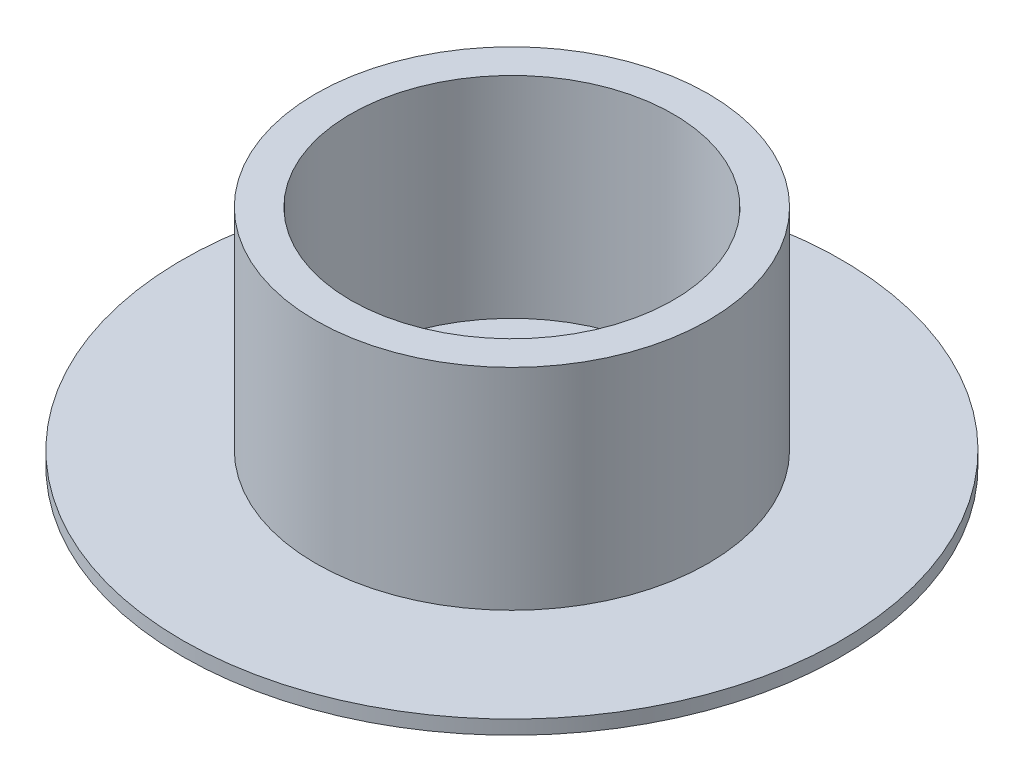
ISO-10303-21;
HEADER;
FILE_DESCRIPTION(('STEP AP214'),'2;1');
FILE_NAME('part.step','',(''),(''),'','','');
FILE_SCHEMA(('AUTOMOTIVE_DESIGN { 1 0 10303 214 1 1 1 1 }'));
ENDSEC;
DATA;
#1=APPLICATION_CONTEXT('core data for automotive mechanical design processes');
#2=APPLICATION_PROTOCOL_DEFINITION('international standard','automotive_design',2000,#1);
#3=PRODUCT_CONTEXT('',#1,'mechanical');
#4=PRODUCT('Part','Part','',(#3));
#5=PRODUCT_RELATED_PRODUCT_CATEGORY('part','',(#4));
#6=PRODUCT_DEFINITION_FORMATION('','',#4);
#7=PRODUCT_DEFINITION_CONTEXT('part definition',#1,'design');
#8=PRODUCT_DEFINITION('design','',#6,#7);
#9=PRODUCT_DEFINITION_SHAPE('','',#8);
#10=(LENGTH_UNIT() NAMED_UNIT(*) SI_UNIT(.MILLI.,.METRE.));
#11=(NAMED_UNIT(*) PLANE_ANGLE_UNIT() SI_UNIT($,.RADIAN.));
#12=(NAMED_UNIT(*) SI_UNIT($,.STERADIAN.) SOLID_ANGLE_UNIT());
#13=UNCERTAINTY_MEASURE_WITH_UNIT(LENGTH_MEASURE(1.E-05),#10,'distance_accuracy_value','');
#14=(GEOMETRIC_REPRESENTATION_CONTEXT(3) GLOBAL_UNCERTAINTY_ASSIGNED_CONTEXT((#13)) GLOBAL_UNIT_ASSIGNED_CONTEXT((#10,
#11,#12)) REPRESENTATION_CONTEXT('',''));
#15=CARTESIAN_POINT('',(0.,0.,0.));
#16=DIRECTION('',(0.,0.,1.));
#17=DIRECTION('',(1.,0.,0.));
#18=AXIS2_PLACEMENT_3D('',#15,#16,#17);
#19=CARTESIAN_POINT('',(0.,2.,0.));
#20=DIRECTION('',(0.,-1.,0.));
#21=DIRECTION('',(0.,0.,-1.));
#22=AXIS2_PLACEMENT_3D('',#19,#20,#21);
#23=CYLINDRICAL_SURFACE('',#22,47.);
#24=CARTESIAN_POINT('',(0.,2.,0.));
#25=DIRECTION('',(0.,1.,0.));
#26=DIRECTION('',(0.,0.,1.));
#27=AXIS2_PLACEMENT_3D('',#24,#25,#26);
#28=CIRCLE('',#27,47.);
#29=CARTESIAN_POINT('',(0.,2.,47.));
#30=VERTEX_POINT('',#29);
#31=EDGE_CURVE('E48',#30,#30,#28,.T.);
#32=ORIENTED_EDGE('',*,*,#31,.F.);
#33=EDGE_LOOP('',(#32));
#34=FACE_BOUND('',#33,.T.);
#35=CARTESIAN_POINT('',(0.,0.,0.));
#36=DIRECTION('',(0.,1.,0.));
#37=DIRECTION('',(0.,0.,1.));
#38=AXIS2_PLACEMENT_3D('',#35,#36,#37);
#39=CIRCLE('',#38,47.);
#40=CARTESIAN_POINT('',(0.,0.,47.));
#41=VERTEX_POINT('',#40);
#42=EDGE_CURVE('E53',#41,#41,#39,.T.);
#43=ORIENTED_EDGE('',*,*,#42,.T.);
#44=EDGE_LOOP('',(#43));
#45=FACE_BOUND('',#44,.T.);
#46=ADVANCED_FACE('F41',(#34,#45),#23,.T.);
#47=CARTESIAN_POINT('',(0.,2.,0.));
#48=DIRECTION('',(0.,1.,0.));
#49=DIRECTION('',(0.,0.,1.));
#50=AXIS2_PLACEMENT_3D('',#47,#48,#49);
#51=PLANE('',#50);
#52=CARTESIAN_POINT('',(0.,2.,0.));
#53=DIRECTION('',(0.,1.,0.));
#54=DIRECTION('',(0.,0.,1.));
#55=AXIS2_PLACEMENT_3D('',#52,#53,#54);
#56=CIRCLE('',#55,28.);
#57=CARTESIAN_POINT('',(0.,2.,28.));
#58=VERTEX_POINT('',#57);
#59=EDGE_CURVE('E61',#58,#58,#56,.T.);
#60=ORIENTED_EDGE('',*,*,#59,.F.);
#61=EDGE_LOOP('',(#60));
#62=FACE_BOUND('',#61,.T.);
#63=ORIENTED_EDGE('',*,*,#31,.T.);
#64=EDGE_LOOP('',(#63));
#65=FACE_BOUND('',#64,.T.);
#66=ADVANCED_FACE('F87',(#62,#65),#51,.T.);
#67=CARTESIAN_POINT('',(0.,0.,0.));
#68=DIRECTION('',(0.,1.,0.));
#69=DIRECTION('',(0.,0.,1.));
#70=AXIS2_PLACEMENT_3D('',#67,#68,#69);
#71=PLANE('',#70);
#72=ORIENTED_EDGE('',*,*,#42,.F.);
#73=EDGE_LOOP('',(#72));
#74=FACE_BOUND('',#73,.T.);
#75=ADVANCED_FACE('F78',(#74),#71,.F.);
#76=CARTESIAN_POINT('',(0.,32.,0.));
#77=DIRECTION('',(0.,1.,0.));
#78=DIRECTION('',(0.,0.,1.));
#79=AXIS2_PLACEMENT_3D('',#76,#77,#78);
#80=PLANE('',#79);
#81=CARTESIAN_POINT('',(0.,32.,0.));
#82=DIRECTION('',(0.,1.,0.));
#83=DIRECTION('',(0.,0.,1.));
#84=AXIS2_PLACEMENT_3D('',#81,#82,#83);
#85=CIRCLE('',#84,28.);
#86=CARTESIAN_POINT('',(0.,32.,28.));
#87=VERTEX_POINT('',#86);
#88=EDGE_CURVE('E59',#87,#87,#85,.T.);
#89=ORIENTED_EDGE('',*,*,#88,.T.);
#90=EDGE_LOOP('',(#89));
#91=FACE_BOUND('',#90,.T.);
#92=CARTESIAN_POINT('',(0.,32.,0.));
#93=DIRECTION('',(0.,1.,0.));
#94=DIRECTION('',(0.,0.,1.));
#95=AXIS2_PLACEMENT_3D('',#92,#93,#94);
#96=CIRCLE('',#95,23.);
#97=CARTESIAN_POINT('',(0.,32.,23.));
#98=VERTEX_POINT('',#97);
#99=EDGE_CURVE('E65',#98,#98,#96,.T.);
#100=ORIENTED_EDGE('',*,*,#99,.F.);
#101=EDGE_LOOP('',(#100));
#102=FACE_BOUND('',#101,.T.);
#103=ADVANCED_FACE('F75',(#91,#102),#80,.T.);
#104=CARTESIAN_POINT('',(0.,32.,0.));
#105=DIRECTION('',(0.,-1.,0.));
#106=DIRECTION('',(0.,0.,-1.));
#107=AXIS2_PLACEMENT_3D('',#104,#105,#106);
#108=CYLINDRICAL_SURFACE('',#107,28.);
#109=ORIENTED_EDGE('',*,*,#88,.F.);
#110=EDGE_LOOP('',(#109));
#111=FACE_BOUND('',#110,.T.);
#112=ORIENTED_EDGE('',*,*,#59,.T.);
#113=EDGE_LOOP('',(#112));
#114=FACE_BOUND('',#113,.T.);
#115=ADVANCED_FACE('F77',(#111,#114),#108,.T.);
#116=CARTESIAN_POINT('',(0.,32.,0.));
#117=DIRECTION('',(0.,-1.,0.));
#118=DIRECTION('',(0.,0.,-1.));
#119=AXIS2_PLACEMENT_3D('',#116,#117,#118);
#120=CYLINDRICAL_SURFACE('',#119,23.);
#121=ORIENTED_EDGE('',*,*,#99,.T.);
#122=EDGE_LOOP('',(#121));
#123=FACE_BOUND('',#122,.T.);
#124=CARTESIAN_POINT('',(0.,2.,0.));
#125=DIRECTION('',(0.,1.,0.));
#126=DIRECTION('',(0.,0.,1.));
#127=AXIS2_PLACEMENT_3D('',#124,#125,#126);
#128=CIRCLE('',#127,23.);
#129=CARTESIAN_POINT('',(0.,2.,23.));
#130=VERTEX_POINT('',#129);
#131=EDGE_CURVE('E10',#130,#130,#128,.F.);
#132=ORIENTED_EDGE('',*,*,#131,.T.);
#133=EDGE_LOOP('',(#132));
#134=FACE_BOUND('',#133,.T.);
#135=ADVANCED_FACE('F73',(#123,#134),#120,.F.);
#136=ORIENTED_EDGE('',*,*,#131,.F.);
#137=EDGE_LOOP('',(#136));
#138=FACE_BOUND('',#137,.T.);
#139=ADVANCED_FACE('F97',(#138),#51,.T.);
#140=CLOSED_SHELL('',(#46,#66,#75,#103,#115,#135,#139));
#141=MANIFOLD_SOLID_BREP('B2',#140);
#142=ADVANCED_BREP_SHAPE_REPRESENTATION('',(#18,#141),#14);
#143=SHAPE_DEFINITION_REPRESENTATION(#9,#142);
ENDSEC;
END-ISO-10303-21;
